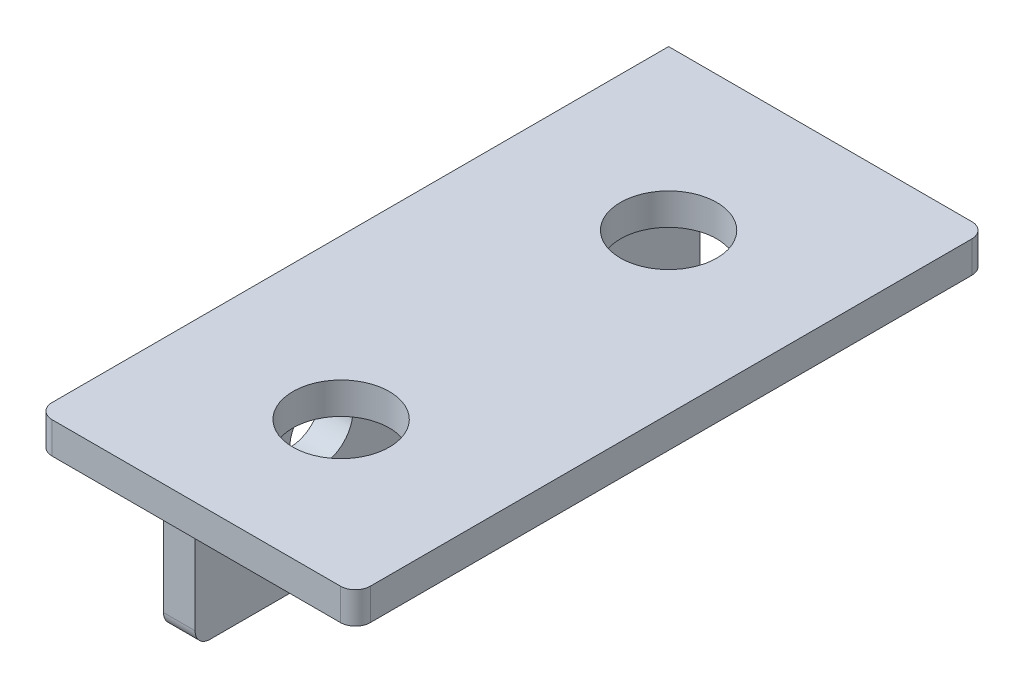
ISO-10303-21;
HEADER;
FILE_DESCRIPTION(('STEP AP214'),'2;1');
FILE_NAME('part.step','',(''),(''),'','','');
FILE_SCHEMA(('AUTOMOTIVE_DESIGN { 1 0 10303 214 1 1 1 1 }'));
ENDSEC;
DATA;
#1=APPLICATION_CONTEXT('core data for automotive mechanical design processes');
#2=APPLICATION_PROTOCOL_DEFINITION('international standard','automotive_design',2000,#1);
#3=PRODUCT_CONTEXT('',#1,'mechanical');
#4=PRODUCT('Part','Part','',(#3));
#5=PRODUCT_RELATED_PRODUCT_CATEGORY('part','',(#4));
#6=PRODUCT_DEFINITION_FORMATION('','',#4);
#7=PRODUCT_DEFINITION_CONTEXT('part definition',#1,'design');
#8=PRODUCT_DEFINITION('design','',#6,#7);
#9=PRODUCT_DEFINITION_SHAPE('','',#8);
#10=(LENGTH_UNIT() NAMED_UNIT(*) SI_UNIT(.MILLI.,.METRE.));
#11=(NAMED_UNIT(*) PLANE_ANGLE_UNIT() SI_UNIT($,.RADIAN.));
#12=(NAMED_UNIT(*) SI_UNIT($,.STERADIAN.) SOLID_ANGLE_UNIT());
#13=UNCERTAINTY_MEASURE_WITH_UNIT(LENGTH_MEASURE(1.E-05),#10,'distance_accuracy_value','');
#14=(GEOMETRIC_REPRESENTATION_CONTEXT(3) GLOBAL_UNCERTAINTY_ASSIGNED_CONTEXT((#13)) GLOBAL_UNIT_ASSIGNED_CONTEXT((#10,
#11,#12)) REPRESENTATION_CONTEXT('',''));
#15=CARTESIAN_POINT('',(0.,0.,0.));
#16=DIRECTION('',(0.,0.,1.));
#17=DIRECTION('',(1.,0.,0.));
#18=AXIS2_PLACEMENT_3D('',#15,#16,#17);
#19=CARTESIAN_POINT('',(3.175,0.,0.));
#20=DIRECTION('',(-1.,0.,0.));
#21=DIRECTION('',(0.,0.,1.));
#22=AXIS2_PLACEMENT_3D('',#19,#20,#21);
#23=PLANE('',#22);
#24=CARTESIAN_POINT('',(3.175,0.,12.7));
#25=DIRECTION('',(-1.,0.,0.));
#26=DIRECTION('',(0.,0.,1.));
#27=AXIS2_PLACEMENT_3D('',#24,#25,#26);
#28=CIRCLE('',#27,3.175);
#29=CARTESIAN_POINT('',(3.175,0.,15.875));
#30=VERTEX_POINT('',#29);
#31=EDGE_CURVE('E198',#30,#30,#28,.T.);
#32=ORIENTED_EDGE('',*,*,#31,.T.);
#33=EDGE_LOOP('',(#32));
#34=FACE_BOUND('',#33,.T.);
#35=DIRECTION('',(0.,-1.,0.));
#36=VECTOR('',#35,1.);
#37=CARTESIAN_POINT('',(3.175,-12.7,25.4));
#38=LINE('',#37,#36);
#39=CARTESIAN_POINT('',(3.175,8.02500000000001,25.4));
#40=VERTEX_POINT('',#39);
#41=CARTESIAN_POINT('',(3.175,-11.2,25.4));
#42=VERTEX_POINT('',#41);
#43=EDGE_CURVE('E224',#40,#42,#38,.T.);
#44=ORIENTED_EDGE('',*,*,#43,.T.);
#45=CARTESIAN_POINT('',(3.175,-11.2,23.9));
#46=DIRECTION('',(-1.,0.,0.));
#47=DIRECTION('',(0.,0.,1.));
#48=AXIS2_PLACEMENT_3D('',#45,#46,#47);
#49=CIRCLE('',#48,1.5);
#50=CARTESIAN_POINT('',(3.175,-12.7,23.9));
#51=VERTEX_POINT('',#50);
#52=EDGE_CURVE('E304',#42,#51,#49,.F.);
#53=ORIENTED_EDGE('',*,*,#52,.T.);
#54=DIRECTION('',(0.,0.,-1.));
#55=VECTOR('',#54,1.);
#56=CARTESIAN_POINT('',(3.175,-12.7,25.4));
#57=LINE('',#56,#55);
#58=CARTESIAN_POINT('',(3.175,-12.7,3.0875));
#59=VERTEX_POINT('',#58);
#60=EDGE_CURVE('E228',#51,#59,#57,.T.);
#61=ORIENTED_EDGE('',*,*,#60,.T.);
#62=DIRECTION('',(0.,-1.,0.));
#63=VECTOR('',#62,1.);
#64=CARTESIAN_POINT('',(3.175,9.52500000000001,3.0875));
#65=LINE('',#64,#63);
#66=CARTESIAN_POINT('',(3.175,8.02500000000001,3.0875));
#67=VERTEX_POINT('',#66);
#68=EDGE_CURVE('E300',#59,#67,#65,.F.);
#69=ORIENTED_EDGE('',*,*,#68,.T.);
#70=DIRECTION('',(0.,0.,-1.));
#71=VECTOR('',#70,1.);
#72=CARTESIAN_POINT('',(3.175,8.02500000000001,25.4));
#73=LINE('',#72,#71);
#74=EDGE_CURVE('E302',#67,#40,#73,.F.);
#75=ORIENTED_EDGE('',*,*,#74,.T.);
#76=EDGE_LOOP('',(#44,#53,#61,#69,#75));
#77=FACE_BOUND('',#76,.T.);
#78=ADVANCED_FACE('F33',(#34,#77),#23,.F.);
#79=CARTESIAN_POINT('',(0.,9.52500000000001,0.));
#80=DIRECTION('',(0.,1.,0.));
#81=DIRECTION('',(0.,0.,1.));
#82=AXIS2_PLACEMENT_3D('',#79,#80,#81);
#83=PLANE('',#82);
#84=CARTESIAN_POINT('',(16.,9.52500000000001,-9.4));
#85=DIRECTION('',(0.,1.,0.));
#86=DIRECTION('',(0.,0.,1.));
#87=AXIS2_PLACEMENT_3D('',#84,#85,#86);
#88=CIRCLE('',#87,4.85);
#89=CARTESIAN_POINT('',(16.,9.52500000000001,-4.55));
#90=VERTEX_POINT('',#89);
#91=EDGE_CURVE('E182',#90,#90,#88,.T.);
#92=ORIENTED_EDGE('',*,*,#91,.T.);
#93=EDGE_LOOP('',(#92));
#94=FACE_BOUND('',#93,.T.);
#95=CARTESIAN_POINT('',(16.,9.52500000000001,23.5362317770223));
#96=DIRECTION('',(0.,1.,0.));
#97=DIRECTION('',(0.,0.,1.));
#98=AXIS2_PLACEMENT_3D('',#95,#96,#97);
#99=CIRCLE('',#98,4.85);
#100=CARTESIAN_POINT('',(16.,9.52500000000001,28.3862317770223));
#101=VERTEX_POINT('',#100);
#102=EDGE_CURVE('E177',#101,#101,#99,.T.);
#103=ORIENTED_EDGE('',*,*,#102,.T.);
#104=EDGE_LOOP('',(#103));
#105=FACE_BOUND('',#104,.T.);
#106=DIRECTION('',(1.,0.,0.));
#107=VECTOR('',#106,1.);
#108=CARTESIAN_POINT('',(0.,9.52500000000001,38.1));
#109=LINE('',#108,#107);
#110=CARTESIAN_POINT('',(1.5,9.52500000000001,38.1));
#111=VERTEX_POINT('',#110);
#112=CARTESIAN_POINT('',(30.5,9.52500000000001,38.1));
#113=VERTEX_POINT('',#112);
#114=EDGE_CURVE('E206',#111,#113,#109,.T.);
#115=ORIENTED_EDGE('',*,*,#114,.F.);
#116=CARTESIAN_POINT('',(1.5,9.52500000000001,36.6));
#117=DIRECTION('',(0.,1.,0.));
#118=DIRECTION('',(0.,0.,1.));
#119=AXIS2_PLACEMENT_3D('',#116,#117,#118);
#120=CIRCLE('',#119,1.5);
#121=CARTESIAN_POINT('',(0.,9.52500000000001,36.6));
#122=VERTEX_POINT('',#121);
#123=EDGE_CURVE('E288',#111,#122,#120,.F.);
#124=ORIENTED_EDGE('',*,*,#123,.T.);
#125=DIRECTION('',(0.,0.,1.));
#126=VECTOR('',#125,1.);
#127=CARTESIAN_POINT('',(0.,9.52500000000001,-25.4));
#128=LINE('',#127,#126);
#129=CARTESIAN_POINT('',(0.,9.52500000000001,26.9));
#130=VERTEX_POINT('',#129);
#131=EDGE_CURVE('E203',#130,#122,#128,.T.);
#132=ORIENTED_EDGE('',*,*,#131,.F.);
#133=DIRECTION('',(1.,0.,0.));
#134=VECTOR('',#133,1.);
#135=CARTESIAN_POINT('',(3.175,9.52500000000001,26.9));
#136=LINE('',#135,#134);
#137=CARTESIAN_POINT('',(4.675,9.52500000000001,26.9));
#138=VERTEX_POINT('',#137);
#139=EDGE_CURVE('E273',#130,#138,#136,.T.);
#140=ORIENTED_EDGE('',*,*,#139,.T.);
#141=DIRECTION('',(0.,0.,-1.));
#142=VECTOR('',#141,1.);
#143=CARTESIAN_POINT('',(4.675,9.52500000000001,1.5875));
#144=LINE('',#143,#142);
#145=CARTESIAN_POINT('',(4.675,9.52500000000001,3.0875));
#146=VERTEX_POINT('',#145);
#147=EDGE_CURVE('E267',#138,#146,#144,.T.);
#148=ORIENTED_EDGE('',*,*,#147,.T.);
#149=DIRECTION('',(-1.,0.,0.));
#150=VECTOR('',#149,1.);
#151=CARTESIAN_POINT('',(25.3999999999999,9.52500000000001,3.0875));
#152=LINE('',#151,#150);
#153=CARTESIAN_POINT('',(26.0213203435596,9.52500000000001,3.0875));
#154=VERTEX_POINT('',#153);
#155=EDGE_CURVE('E144',#146,#154,#152,.F.);
#156=ORIENTED_EDGE('',*,*,#155,.T.);
#157=DIRECTION('',(0.,0.,-1.));
#158=VECTOR('',#157,1.);
#159=CARTESIAN_POINT('',(26.0213203435596,9.52500000000001,-1.5875));
#160=LINE('',#159,#158);
#161=CARTESIAN_POINT('',(26.0213203435596,9.52500000000001,-3.0875));
#162=VERTEX_POINT('',#161);
#163=EDGE_CURVE('E270',#154,#162,#160,.T.);
#164=ORIENTED_EDGE('',*,*,#163,.T.);
#165=DIRECTION('',(-1.,0.,0.));
#166=VECTOR('',#165,1.);
#167=CARTESIAN_POINT('',(0.,9.52500000000001,-3.0875));
#168=LINE('',#167,#166);
#169=CARTESIAN_POINT('',(4.675,9.52500000000001,-3.0875));
#170=VERTEX_POINT('',#169);
#171=EDGE_CURVE('E276',#162,#170,#168,.T.);
#172=ORIENTED_EDGE('',*,*,#171,.T.);
#173=DIRECTION('',(0.,0.,-1.));
#174=VECTOR('',#173,1.);
#175=CARTESIAN_POINT('',(4.675,9.52500000000001,-25.4));
#176=LINE('',#175,#174);
#177=CARTESIAN_POINT('',(4.675,9.52500000000001,-25.4));
#178=VERTEX_POINT('',#177);
#179=EDGE_CURVE('E279',#170,#178,#176,.T.);
#180=ORIENTED_EDGE('',*,*,#179,.T.);
#181=DIRECTION('',(-1.,0.,0.));
#182=VECTOR('',#181,1.);
#183=CARTESIAN_POINT('',(0.,9.52500000000001,-25.4));
#184=LINE('',#183,#182);
#185=CARTESIAN_POINT('',(30.5,9.52500000000001,-25.4));
#186=VERTEX_POINT('',#185);
#187=EDGE_CURVE('E213',#186,#178,#184,.T.);
#188=ORIENTED_EDGE('',*,*,#187,.F.);
#189=CARTESIAN_POINT('',(30.5,9.52500000000001,-23.9));
#190=DIRECTION('',(0.,1.,0.));
#191=DIRECTION('',(0.,0.,1.));
#192=AXIS2_PLACEMENT_3D('',#189,#190,#191);
#193=CIRCLE('',#192,1.5);
#194=CARTESIAN_POINT('',(32.,9.52500000000001,-23.9));
#195=VERTEX_POINT('',#194);
#196=EDGE_CURVE('E282',#186,#195,#193,.F.);
#197=ORIENTED_EDGE('',*,*,#196,.T.);
#198=DIRECTION('',(0.,0.,-1.));
#199=VECTOR('',#198,1.);
#200=CARTESIAN_POINT('',(32.,9.52500000000001,-25.4));
#201=LINE('',#200,#199);
#202=CARTESIAN_POINT('',(32.,9.52500000000001,36.6));
#203=VERTEX_POINT('',#202);
#204=EDGE_CURVE('E210',#203,#195,#201,.T.);
#205=ORIENTED_EDGE('',*,*,#204,.F.);
#206=CARTESIAN_POINT('',(30.5,9.52500000000001,36.6));
#207=DIRECTION('',(0.,1.,0.));
#208=DIRECTION('',(0.,0.,1.));
#209=AXIS2_PLACEMENT_3D('',#206,#207,#208);
#210=CIRCLE('',#209,1.5);
#211=EDGE_CURVE('E285',#203,#113,#210,.F.);
#212=ORIENTED_EDGE('',*,*,#211,.T.);
#213=EDGE_LOOP('',(#115,#124,#132,#140,#148,#156,#164,#172,#180,#188,#197,#205,#212));
#214=FACE_BOUND('',#213,.T.);
#215=ADVANCED_FACE('F354',(#94,#105,#214),#83,.F.);
#216=CARTESIAN_POINT('',(3.175,-12.7,25.4));
#217=DIRECTION('',(0.,0.,-1.));
#218=DIRECTION('',(-1.,0.,0.));
#219=AXIS2_PLACEMENT_3D('',#216,#217,#218);
#220=PLANE('',#219);
#221=ORIENTED_EDGE('',*,*,#43,.F.);
#222=DIRECTION('',(1.,0.,0.));
#223=VECTOR('',#222,1.);
#224=CARTESIAN_POINT('',(0.,8.02500000000001,25.4));
#225=LINE('',#224,#223);
#226=CARTESIAN_POINT('',(0.,8.02500000000001,25.4));
#227=VERTEX_POINT('',#226);
#228=EDGE_CURVE('E292',#40,#227,#225,.F.);
#229=ORIENTED_EDGE('',*,*,#228,.T.);
#230=DIRECTION('',(0.,-1.,0.));
#231=VECTOR('',#230,1.);
#232=CARTESIAN_POINT('',(0.,-12.7,25.4));
#233=LINE('',#232,#231);
#234=CARTESIAN_POINT('',(0.,-11.2,25.4));
#235=VERTEX_POINT('',#234);
#236=EDGE_CURVE('E236',#227,#235,#233,.T.);
#237=ORIENTED_EDGE('',*,*,#236,.T.);
#238=DIRECTION('',(-1.,0.,0.));
#239=VECTOR('',#238,1.);
#240=CARTESIAN_POINT('',(3.175,-11.2,25.4));
#241=LINE('',#240,#239);
#242=EDGE_CURVE('E79',#235,#42,#241,.F.);
#243=ORIENTED_EDGE('',*,*,#242,.T.);
#244=EDGE_LOOP('',(#221,#229,#237,#243));
#245=FACE_BOUND('',#244,.T.);
#246=ADVANCED_FACE('F472',(#245),#220,.F.);
#247=CARTESIAN_POINT('',(3.175,0.,-12.7));
#248=DIRECTION('',(-1.,0.,0.));
#249=DIRECTION('',(0.,0.,1.));
#250=AXIS2_PLACEMENT_3D('',#247,#248,#249);
#251=CIRCLE('',#250,3.175);
#252=CARTESIAN_POINT('',(3.175,0.,-9.525));
#253=VERTEX_POINT('',#252);
#254=EDGE_CURVE('E191',#253,#253,#251,.T.);
#255=ORIENTED_EDGE('',*,*,#254,.T.);
#256=EDGE_LOOP('',(#255));
#257=FACE_BOUND('',#256,.T.);
#258=CARTESIAN_POINT('',(3.175,-12.7,-3.0875));
#259=VERTEX_POINT('',#258);
#260=CARTESIAN_POINT('',(3.175,-12.7,-23.9));
#261=VERTEX_POINT('',#260);
#262=EDGE_CURVE('E227',#259,#261,#57,.T.);
#263=ORIENTED_EDGE('',*,*,#262,.T.);
#264=CARTESIAN_POINT('',(3.175,-11.2,-23.9));
#265=DIRECTION('',(-1.,0.,0.));
#266=DIRECTION('',(0.,0.,1.));
#267=AXIS2_PLACEMENT_3D('',#264,#265,#266);
#268=CIRCLE('',#267,1.5);
#269=CARTESIAN_POINT('',(3.175,-11.2,-25.4));
#270=VERTEX_POINT('',#269);
#271=EDGE_CURVE('E316',#261,#270,#268,.F.);
#272=ORIENTED_EDGE('',*,*,#271,.T.);
#273=DIRECTION('',(0.,1.,0.));
#274=VECTOR('',#273,1.);
#275=CARTESIAN_POINT('',(3.175,-12.7,-25.4));
#276=LINE('',#275,#274);
#277=CARTESIAN_POINT('',(3.175,8.02500000000001,-25.4));
#278=VERTEX_POINT('',#277);
#279=EDGE_CURVE('E221',#270,#278,#276,.T.);
#280=ORIENTED_EDGE('',*,*,#279,.T.);
#281=DIRECTION('',(0.,0.,-1.));
#282=VECTOR('',#281,1.);
#283=CARTESIAN_POINT('',(3.175,8.02500000000001,-1.5875));
#284=LINE('',#283,#282);
#285=CARTESIAN_POINT('',(3.175,8.02500000000001,-3.0875));
#286=VERTEX_POINT('',#285);
#287=EDGE_CURVE('E312',#278,#286,#284,.F.);
#288=ORIENTED_EDGE('',*,*,#287,.T.);
#289=DIRECTION('',(0.,-1.,0.));
#290=VECTOR('',#289,1.);
#291=CARTESIAN_POINT('',(3.175,0.,-3.0875));
#292=LINE('',#291,#290);
#293=EDGE_CURVE('E314',#286,#259,#292,.T.);
#294=ORIENTED_EDGE('',*,*,#293,.T.);
#295=EDGE_LOOP('',(#263,#272,#280,#288,#294));
#296=FACE_BOUND('',#295,.T.);
#297=ADVANCED_FACE('F423',(#257,#296),#23,.F.);
#298=CARTESIAN_POINT('',(3.175,-12.7,-25.4));
#299=DIRECTION('',(0.,0.,1.));
#300=DIRECTION('',(1.,0.,0.));
#301=AXIS2_PLACEMENT_3D('',#298,#299,#300);
#302=PLANE('',#301);
#303=ORIENTED_EDGE('',*,*,#279,.F.);
#304=DIRECTION('',(-1.,0.,0.));
#305=VECTOR('',#304,1.);
#306=CARTESIAN_POINT('',(3.175,-11.2,-25.4));
#307=LINE('',#306,#305);
#308=CARTESIAN_POINT('',(0.,-11.2,-25.4));
#309=VERTEX_POINT('',#308);
#310=EDGE_CURVE('E309',#270,#309,#307,.T.);
#311=ORIENTED_EDGE('',*,*,#310,.T.);
#312=DIRECTION('',(0.,1.,0.));
#313=VECTOR('',#312,1.);
#314=CARTESIAN_POINT('',(0.,-12.7,-25.4));
#315=LINE('',#314,#313);
#316=CARTESIAN_POINT('',(0.,12.7,-25.4));
#317=VERTEX_POINT('',#316);
#318=EDGE_CURVE('E216',#309,#317,#315,.T.);
#319=ORIENTED_EDGE('',*,*,#318,.T.);
#320=DIRECTION('',(-1.,0.,0.));
#321=VECTOR('',#320,1.);
#322=CARTESIAN_POINT('',(3.175,12.7,-25.4));
#323=LINE('',#322,#321);
#324=CARTESIAN_POINT('',(30.5,12.7,-25.4));
#325=VERTEX_POINT('',#324);
#326=EDGE_CURVE('E230',#325,#317,#323,.T.);
#327=ORIENTED_EDGE('',*,*,#326,.F.);
#328=DIRECTION('',(0.,1.,0.));
#329=VECTOR('',#328,1.);
#330=CARTESIAN_POINT('',(30.5,9.52500000000001,-25.4));
#331=LINE('',#330,#329);
#332=EDGE_CURVE('E306',#325,#186,#331,.F.);
#333=ORIENTED_EDGE('',*,*,#332,.T.);
#334=ORIENTED_EDGE('',*,*,#187,.T.);
#335=CARTESIAN_POINT('',(4.675,8.02500000000001,-25.4));
#336=DIRECTION('',(0.,0.,1.));
#337=DIRECTION('',(1.,0.,0.));
#338=AXIS2_PLACEMENT_3D('',#335,#336,#337);
#339=CIRCLE('',#338,1.5);
#340=EDGE_CURVE('E334',#178,#278,#339,.T.);
#341=ORIENTED_EDGE('',*,*,#340,.T.);
#342=EDGE_LOOP('',(#303,#311,#319,#327,#333,#334,#341));
#343=FACE_BOUND('',#342,.T.);
#344=ADVANCED_FACE('F419',(#343),#302,.F.);
#345=CARTESIAN_POINT('',(3.175,12.7,25.4));
#346=DIRECTION('',(0.,-1.,0.));
#347=DIRECTION('',(0.,0.,-1.));
#348=AXIS2_PLACEMENT_3D('',#345,#346,#347);
#349=PLANE('',#348);
#350=CARTESIAN_POINT('',(16.,12.7,-9.4));
#351=DIRECTION('',(0.,1.,0.));
#352=DIRECTION('',(0.,0.,1.));
#353=AXIS2_PLACEMENT_3D('',#350,#351,#352);
#354=CIRCLE('',#353,4.85);
#355=CARTESIAN_POINT('',(16.,12.7,-4.55));
#356=VERTEX_POINT('',#355);
#357=EDGE_CURVE('E172',#356,#356,#354,.T.);
#358=ORIENTED_EDGE('',*,*,#357,.F.);
#359=EDGE_LOOP('',(#358));
#360=FACE_BOUND('',#359,.T.);
#361=CARTESIAN_POINT('',(16.,12.7,23.5362317770223));
#362=DIRECTION('',(0.,1.,0.));
#363=DIRECTION('',(0.,0.,1.));
#364=AXIS2_PLACEMENT_3D('',#361,#362,#363);
#365=CIRCLE('',#364,4.85);
#366=CARTESIAN_POINT('',(16.,12.7,28.3862317770223));
#367=VERTEX_POINT('',#366);
#368=EDGE_CURVE('E169',#367,#367,#365,.T.);
#369=ORIENTED_EDGE('',*,*,#368,.F.);
#370=EDGE_LOOP('',(#369));
#371=FACE_BOUND('',#370,.T.);
#372=DIRECTION('',(0.,0.,1.));
#373=VECTOR('',#372,1.);
#374=CARTESIAN_POINT('',(0.,12.7,25.4));
#375=LINE('',#374,#373);
#376=CARTESIAN_POINT('',(0.,12.7,36.6));
#377=VERTEX_POINT('',#376);
#378=EDGE_CURVE('E233',#317,#377,#375,.T.);
#379=ORIENTED_EDGE('',*,*,#378,.T.);
#380=CARTESIAN_POINT('',(1.5,12.7,36.6));
#381=DIRECTION('',(0.,-1.,0.));
#382=DIRECTION('',(0.,0.,-1.));
#383=AXIS2_PLACEMENT_3D('',#380,#381,#382);
#384=CIRCLE('',#383,1.5);
#385=CARTESIAN_POINT('',(1.5,12.7,38.1));
#386=VERTEX_POINT('',#385);
#387=EDGE_CURVE('E257',#377,#386,#384,.F.);
#388=ORIENTED_EDGE('',*,*,#387,.T.);
#389=DIRECTION('',(1.,0.,0.));
#390=VECTOR('',#389,1.);
#391=CARTESIAN_POINT('',(0.,12.7,38.1));
#392=LINE('',#391,#390);
#393=CARTESIAN_POINT('',(30.5,12.7,38.1));
#394=VERTEX_POINT('',#393);
#395=EDGE_CURVE('E194',#386,#394,#392,.T.);
#396=ORIENTED_EDGE('',*,*,#395,.T.);
#397=CARTESIAN_POINT('',(30.5,12.7,36.6));
#398=DIRECTION('',(0.,-1.,0.));
#399=DIRECTION('',(0.,0.,-1.));
#400=AXIS2_PLACEMENT_3D('',#397,#398,#399);
#401=CIRCLE('',#400,1.5);
#402=CARTESIAN_POINT('',(32.,12.7,36.6));
#403=VERTEX_POINT('',#402);
#404=EDGE_CURVE('E254',#394,#403,#401,.F.);
#405=ORIENTED_EDGE('',*,*,#404,.T.);
#406=DIRECTION('',(0.,0.,-1.));
#407=VECTOR('',#406,1.);
#408=CARTESIAN_POINT('',(32.,12.7,-25.4));
#409=LINE('',#408,#407);
#410=CARTESIAN_POINT('',(32.,12.7,-23.9));
#411=VERTEX_POINT('',#410);
#412=EDGE_CURVE('E207',#403,#411,#409,.T.);
#413=ORIENTED_EDGE('',*,*,#412,.T.);
#414=CARTESIAN_POINT('',(30.5,12.7,-23.9));
#415=DIRECTION('',(0.,-1.,0.));
#416=DIRECTION('',(0.,0.,-1.));
#417=AXIS2_PLACEMENT_3D('',#414,#415,#416);
#418=CIRCLE('',#417,1.5);
#419=EDGE_CURVE('E251',#411,#325,#418,.F.);
#420=ORIENTED_EDGE('',*,*,#419,.T.);
#421=ORIENTED_EDGE('',*,*,#326,.T.);
#422=EDGE_LOOP('',(#379,#388,#396,#405,#413,#420,#421));
#423=FACE_BOUND('',#422,.T.);
#424=ADVANCED_FACE('F377',(#360,#371,#423),#349,.F.);
#425=CARTESIAN_POINT('',(3.175,-12.7,25.4));
#426=DIRECTION('',(0.,1.,0.));
#427=DIRECTION('',(0.,0.,1.));
#428=AXIS2_PLACEMENT_3D('',#425,#426,#427);
#429=PLANE('',#428);
#430=ORIENTED_EDGE('',*,*,#60,.F.);
#431=DIRECTION('',(-1.,0.,0.));
#432=VECTOR('',#431,1.);
#433=CARTESIAN_POINT('',(3.175,-12.7,23.9));
#434=LINE('',#433,#432);
#435=CARTESIAN_POINT('',(0.,-12.7,23.9));
#436=VERTEX_POINT('',#435);
#437=EDGE_CURVE('E297',#51,#436,#434,.T.);
#438=ORIENTED_EDGE('',*,*,#437,.T.);
#439=DIRECTION('',(0.,0.,-1.));
#440=VECTOR('',#439,1.);
#441=CARTESIAN_POINT('',(0.,-12.7,25.4));
#442=LINE('',#441,#440);
#443=CARTESIAN_POINT('',(0.,-12.7,-23.9));
#444=VERTEX_POINT('',#443);
#445=EDGE_CURVE('E225',#436,#444,#442,.T.);
#446=ORIENTED_EDGE('',*,*,#445,.T.);
#447=DIRECTION('',(-1.,0.,0.));
#448=VECTOR('',#447,1.);
#449=CARTESIAN_POINT('',(3.175,-12.7,-23.9));
#450=LINE('',#449,#448);
#451=EDGE_CURVE('E295',#444,#261,#450,.F.);
#452=ORIENTED_EDGE('',*,*,#451,.T.);
#453=ORIENTED_EDGE('',*,*,#262,.F.);
#454=DIRECTION('',(0.,0.,-1.));
#455=VECTOR('',#454,1.);
#456=CARTESIAN_POINT('',(3.175,-12.7,1.5875));
#457=LINE('',#456,#455);
#458=EDGE_CURVE('E50',#59,#259,#457,.T.);
#459=ORIENTED_EDGE('',*,*,#458,.F.);
#460=EDGE_LOOP('',(#430,#438,#446,#452,#453,#459));
#461=FACE_BOUND('',#460,.T.);
#462=ADVANCED_FACE('F462',(#461),#429,.F.);
#463=CARTESIAN_POINT('',(0.,0.,0.));
#464=DIRECTION('',(-1.,0.,0.));
#465=DIRECTION('',(0.,0.,1.));
#466=AXIS2_PLACEMENT_3D('',#463,#464,#465);
#467=PLANE('',#466);
#468=CARTESIAN_POINT('',(0.,0.,-12.7));
#469=DIRECTION('',(-1.,0.,0.));
#470=DIRECTION('',(0.,0.,1.));
#471=AXIS2_PLACEMENT_3D('',#468,#469,#470);
#472=CIRCLE('',#471,3.175);
#473=CARTESIAN_POINT('',(0.,0.,-9.525));
#474=VERTEX_POINT('',#473);
#475=EDGE_CURVE('E195',#474,#474,#472,.T.);
#476=ORIENTED_EDGE('',*,*,#475,.F.);
#477=EDGE_LOOP('',(#476));
#478=FACE_BOUND('',#477,.T.);
#479=CARTESIAN_POINT('',(0.,0.,12.7));
#480=DIRECTION('',(-1.,0.,0.));
#481=DIRECTION('',(0.,0.,1.));
#482=AXIS2_PLACEMENT_3D('',#479,#480,#481);
#483=CIRCLE('',#482,3.175);
#484=CARTESIAN_POINT('',(0.,0.,15.875));
#485=VERTEX_POINT('',#484);
#486=EDGE_CURVE('E190',#485,#485,#483,.T.);
#487=ORIENTED_EDGE('',*,*,#486,.F.);
#488=EDGE_LOOP('',(#487));
#489=FACE_BOUND('',#488,.T.);
#490=ORIENTED_EDGE('',*,*,#131,.T.);
#491=DIRECTION('',(0.,1.,0.));
#492=VECTOR('',#491,1.);
#493=CARTESIAN_POINT('',(0.,0.,36.6));
#494=LINE('',#493,#492);
#495=EDGE_CURVE('E248',#122,#377,#494,.T.);
#496=ORIENTED_EDGE('',*,*,#495,.T.);
#497=ORIENTED_EDGE('',*,*,#378,.F.);
#498=ORIENTED_EDGE('',*,*,#318,.F.);
#499=CARTESIAN_POINT('',(0.,-11.2,-23.9));
#500=DIRECTION('',(-1.,0.,0.));
#501=DIRECTION('',(0.,0.,1.));
#502=AXIS2_PLACEMENT_3D('',#499,#500,#501);
#503=CIRCLE('',#502,1.5);
#504=EDGE_CURVE('E242',#309,#444,#503,.T.);
#505=ORIENTED_EDGE('',*,*,#504,.T.);
#506=ORIENTED_EDGE('',*,*,#445,.F.);
#507=CARTESIAN_POINT('',(0.,-11.2,23.9));
#508=DIRECTION('',(-1.,0.,0.));
#509=DIRECTION('',(0.,0.,1.));
#510=AXIS2_PLACEMENT_3D('',#507,#508,#509);
#511=CIRCLE('',#510,1.5);
#512=EDGE_CURVE('E245',#436,#235,#511,.T.);
#513=ORIENTED_EDGE('',*,*,#512,.T.);
#514=ORIENTED_EDGE('',*,*,#236,.F.);
#515=CARTESIAN_POINT('',(0.,8.02500000000001,26.9));
#516=DIRECTION('',(-1.,0.,0.));
#517=DIRECTION('',(0.,0.,1.));
#518=AXIS2_PLACEMENT_3D('',#515,#516,#517);
#519=CIRCLE('',#518,1.5);
#520=EDGE_CURVE('E125',#227,#130,#519,.F.);
#521=ORIENTED_EDGE('',*,*,#520,.T.);
#522=EDGE_LOOP('',(#490,#496,#497,#498,#505,#506,#513,#514,#521));
#523=FACE_BOUND('',#522,.T.);
#524=ADVANCED_FACE('F361',(#478,#489,#523),#467,.T.);
#525=CARTESIAN_POINT('',(32.,9.52500000000001,-25.4));
#526=DIRECTION('',(1.,0.,0.));
#527=DIRECTION('',(0.,0.,-1.));
#528=AXIS2_PLACEMENT_3D('',#525,#526,#527);
#529=PLANE('',#528);
#530=ORIENTED_EDGE('',*,*,#412,.F.);
#531=DIRECTION('',(0.,1.,0.));
#532=VECTOR('',#531,1.);
#533=CARTESIAN_POINT('',(32.,9.52500000000001,36.6));
#534=LINE('',#533,#532);
#535=EDGE_CURVE('E321',#403,#203,#534,.F.);
#536=ORIENTED_EDGE('',*,*,#535,.T.);
#537=ORIENTED_EDGE('',*,*,#204,.T.);
#538=DIRECTION('',(0.,1.,0.));
#539=VECTOR('',#538,1.);
#540=CARTESIAN_POINT('',(32.,12.7,-23.9));
#541=LINE('',#540,#539);
#542=EDGE_CURVE('E318',#195,#411,#541,.T.);
#543=ORIENTED_EDGE('',*,*,#542,.T.);
#544=EDGE_LOOP('',(#530,#536,#537,#543));
#545=FACE_BOUND('',#544,.T.);
#546=ADVANCED_FACE('F453',(#545),#529,.T.);
#547=CARTESIAN_POINT('',(0.,9.52500000000001,38.1));
#548=DIRECTION('',(0.,0.,1.));
#549=DIRECTION('',(1.,0.,0.));
#550=AXIS2_PLACEMENT_3D('',#547,#548,#549);
#551=PLANE('',#550);
#552=ORIENTED_EDGE('',*,*,#395,.F.);
#553=DIRECTION('',(0.,1.,0.));
#554=VECTOR('',#553,1.);
#555=CARTESIAN_POINT('',(1.5,9.52500000000001,38.1));
#556=LINE('',#555,#554);
#557=EDGE_CURVE('E263',#386,#111,#556,.F.);
#558=ORIENTED_EDGE('',*,*,#557,.T.);
#559=ORIENTED_EDGE('',*,*,#114,.T.);
#560=DIRECTION('',(0.,1.,0.));
#561=VECTOR('',#560,1.);
#562=CARTESIAN_POINT('',(30.5,9.52500000000001,38.1));
#563=LINE('',#562,#561);
#564=EDGE_CURVE('E260',#113,#394,#563,.T.);
#565=ORIENTED_EDGE('',*,*,#564,.T.);
#566=EDGE_LOOP('',(#552,#558,#559,#565));
#567=FACE_BOUND('',#566,.T.);
#568=ADVANCED_FACE('F381',(#567),#551,.T.);
#569=CARTESIAN_POINT('',(3.175,0.,12.7));
#570=DIRECTION('',(-1.,0.,0.));
#571=DIRECTION('',(0.,0.,1.));
#572=AXIS2_PLACEMENT_3D('',#569,#570,#571);
#573=CYLINDRICAL_SURFACE('',#572,3.175);
#574=ORIENTED_EDGE('',*,*,#31,.F.);
#575=EDGE_LOOP('',(#574));
#576=FACE_BOUND('',#575,.T.);
#577=ORIENTED_EDGE('',*,*,#486,.T.);
#578=EDGE_LOOP('',(#577));
#579=FACE_BOUND('',#578,.T.);
#580=ADVANCED_FACE('F460',(#576,#579),#573,.F.);
#581=CARTESIAN_POINT('',(3.175,0.,-12.7));
#582=DIRECTION('',(-1.,0.,0.));
#583=DIRECTION('',(0.,0.,1.));
#584=AXIS2_PLACEMENT_3D('',#581,#582,#583);
#585=CYLINDRICAL_SURFACE('',#584,3.175);
#586=ORIENTED_EDGE('',*,*,#254,.F.);
#587=EDGE_LOOP('',(#586));
#588=FACE_BOUND('',#587,.T.);
#589=ORIENTED_EDGE('',*,*,#475,.T.);
#590=EDGE_LOOP('',(#589));
#591=FACE_BOUND('',#590,.T.);
#592=ADVANCED_FACE('F485',(#588,#591),#585,.F.);
#593=CARTESIAN_POINT('',(3.175,-12.7,1.5875));
#594=DIRECTION('',(-0.707106781186549,0.707106781186546,0.));
#595=DIRECTION('',(-0.707106781186546,-0.707106781186549,0.));
#596=AXIS2_PLACEMENT_3D('',#593,#594,#595);
#597=PLANE('',#596);
#598=DIRECTION('',(0.707106781186546,0.707106781186549,0.));
#599=VECTOR('',#598,1.);
#600=CARTESIAN_POINT('',(3.175,-12.7,-1.5875));
#601=LINE('',#600,#599);
#602=CARTESIAN_POINT('',(4.675,-11.2,-1.5875));
#603=VERTEX_POINT('',#602);
#604=CARTESIAN_POINT('',(23.8999999999999,8.025,-1.5875));
#605=VERTEX_POINT('',#604);
#606=EDGE_CURVE('E185',#603,#605,#601,.T.);
#607=ORIENTED_EDGE('',*,*,#606,.T.);
#608=CARTESIAN_POINT('',(23.8999999999999,8.02500000000001,-3.0875));
#609=DIRECTION('',(-0.707106781186549,0.707106781186546,0.));
#610=DIRECTION('',(-0.707106781186546,-0.707106781186549,0.));
#611=AXIS2_PLACEMENT_3D('',#608,#609,#610);
#612=ELLIPSE('',#611,2.12132034355964,1.5);
#613=CARTESIAN_POINT('',(24.9606601717797,9.08566017177982,-2.02683982822018));
#614=VERTEX_POINT('',#613);
#615=EDGE_CURVE('E330',#605,#614,#612,.T.);
#616=ORIENTED_EDGE('',*,*,#615,.T.);
#617=DIRECTION('',(0.,0.,-1.));
#618=VECTOR('',#617,1.);
#619=CARTESIAN_POINT('',(24.9606601717797,9.08566017177982,1.5875));
#620=LINE('',#619,#618);
#621=CARTESIAN_POINT('',(24.9606601717797,9.08566017177982,2.02683982822018));
#622=VERTEX_POINT('',#621);
#623=EDGE_CURVE('E59',#614,#622,#620,.F.);
#624=ORIENTED_EDGE('',*,*,#623,.T.);
#625=CARTESIAN_POINT('',(23.8999999999999,8.02500000000001,3.0875));
#626=DIRECTION('',(-0.707106781186549,0.707106781186546,0.));
#627=DIRECTION('',(0.707106781186546,0.707106781186549,0.));
#628=AXIS2_PLACEMENT_3D('',#625,#626,#627);
#629=ELLIPSE('',#628,2.12132034355964,1.5);
#630=CARTESIAN_POINT('',(23.8999999999999,8.025,1.5875));
#631=VERTEX_POINT('',#630);
#632=EDGE_CURVE('E42',#622,#631,#629,.T.);
#633=ORIENTED_EDGE('',*,*,#632,.T.);
#634=DIRECTION('',(0.707106781186546,0.707106781186549,0.));
#635=VECTOR('',#634,1.);
#636=CARTESIAN_POINT('',(3.175,-12.7,1.5875));
#637=LINE('',#636,#635);
#638=CARTESIAN_POINT('',(4.675,-11.2,1.5875));
#639=VERTEX_POINT('',#638);
#640=EDGE_CURVE('E121',#639,#631,#637,.T.);
#641=ORIENTED_EDGE('',*,*,#640,.F.);
#642=CARTESIAN_POINT('',(4.675,-11.2,3.0875));
#643=DIRECTION('',(-0.707106781186549,0.707106781186546,0.));
#644=DIRECTION('',(0.707106781186546,0.707106781186549,0.));
#645=AXIS2_PLACEMENT_3D('',#642,#643,#644);
#646=ELLIPSE('',#645,2.12132034355965,1.5);
#647=EDGE_CURVE('E11',#639,#59,#646,.T.);
#648=ORIENTED_EDGE('',*,*,#647,.T.);
#649=ORIENTED_EDGE('',*,*,#458,.T.);
#650=CARTESIAN_POINT('',(4.675,-11.2,-3.0875));
#651=DIRECTION('',(-0.707106781186549,0.707106781186546,0.));
#652=DIRECTION('',(-0.707106781186546,-0.707106781186549,0.));
#653=AXIS2_PLACEMENT_3D('',#650,#651,#652);
#654=ELLIPSE('',#653,2.12132034355965,1.5);
#655=EDGE_CURVE('E332',#259,#603,#654,.T.);
#656=ORIENTED_EDGE('',*,*,#655,.T.);
#657=EDGE_LOOP('',(#607,#616,#624,#633,#641,#648,#649,#656));
#658=FACE_BOUND('',#657,.T.);
#659=ADVANCED_FACE('F488',(#658),#597,.F.);
#660=CARTESIAN_POINT('',(0.,0.,1.5875));
#661=DIRECTION('',(0.,0.,-1.));
#662=DIRECTION('',(-1.,0.,0.));
#663=AXIS2_PLACEMENT_3D('',#660,#661,#662);
#664=PLANE('',#663);
#665=ORIENTED_EDGE('',*,*,#640,.T.);
#666=DIRECTION('',(-1.,0.,0.));
#667=VECTOR('',#666,1.);
#668=CARTESIAN_POINT('',(3.175,8.02500000000001,1.5875));
#669=LINE('',#668,#667);
#670=CARTESIAN_POINT('',(4.675,8.02500000000001,1.5875));
#671=VERTEX_POINT('',#670);
#672=EDGE_CURVE('E116',#631,#671,#669,.T.);
#673=ORIENTED_EDGE('',*,*,#672,.T.);
#674=DIRECTION('',(0.,-1.,0.));
#675=VECTOR('',#674,1.);
#676=CARTESIAN_POINT('',(4.675,-12.7,1.5875));
#677=LINE('',#676,#675);
#678=EDGE_CURVE('E119',#671,#639,#677,.T.);
#679=ORIENTED_EDGE('',*,*,#678,.T.);
#680=EDGE_LOOP('',(#665,#673,#679));
#681=FACE_BOUND('',#680,.T.);
#682=ADVANCED_FACE('F118',(#681),#664,.F.);
#683=CARTESIAN_POINT('',(0.,0.,-1.5875));
#684=DIRECTION('',(0.,0.,-1.));
#685=DIRECTION('',(-1.,0.,0.));
#686=AXIS2_PLACEMENT_3D('',#683,#684,#685);
#687=PLANE('',#686);
#688=DIRECTION('',(0.,-1.,0.));
#689=VECTOR('',#688,1.);
#690=CARTESIAN_POINT('',(4.675,0.,-1.5875));
#691=LINE('',#690,#689);
#692=CARTESIAN_POINT('',(4.675,8.02500000000001,-1.5875));
#693=VERTEX_POINT('',#692);
#694=EDGE_CURVE('E325',#603,#693,#691,.F.);
#695=ORIENTED_EDGE('',*,*,#694,.T.);
#696=DIRECTION('',(-1.,0.,0.));
#697=VECTOR('',#696,1.);
#698=CARTESIAN_POINT('',(0.,8.02500000000001,-1.5875));
#699=LINE('',#698,#697);
#700=EDGE_CURVE('E135',#693,#605,#699,.F.);
#701=ORIENTED_EDGE('',*,*,#700,.T.);
#702=ORIENTED_EDGE('',*,*,#606,.F.);
#703=EDGE_LOOP('',(#695,#701,#702));
#704=FACE_BOUND('',#703,.T.);
#705=ADVANCED_FACE('F503',(#704),#687,.T.);
#706=CARTESIAN_POINT('',(16.,2.7,23.5362317770223));
#707=DIRECTION('',(0.,1.,0.));
#708=DIRECTION('',(0.,0.,1.));
#709=AXIS2_PLACEMENT_3D('',#706,#707,#708);
#710=CYLINDRICAL_SURFACE('',#709,4.85);
#711=ORIENTED_EDGE('',*,*,#368,.T.);
#712=EDGE_LOOP('',(#711));
#713=FACE_BOUND('',#712,.T.);
#714=ORIENTED_EDGE('',*,*,#102,.F.);
#715=EDGE_LOOP('',(#714));
#716=FACE_BOUND('',#715,.T.);
#717=ADVANCED_FACE('F506',(#713,#716),#710,.F.);
#718=CARTESIAN_POINT('',(16.,2.7,-9.4));
#719=DIRECTION('',(0.,1.,0.));
#720=DIRECTION('',(0.,0.,1.));
#721=AXIS2_PLACEMENT_3D('',#718,#719,#720);
#722=CYLINDRICAL_SURFACE('',#721,4.85);
#723=ORIENTED_EDGE('',*,*,#357,.T.);
#724=EDGE_LOOP('',(#723));
#725=FACE_BOUND('',#724,.T.);
#726=ORIENTED_EDGE('',*,*,#91,.F.);
#727=EDGE_LOOP('',(#726));
#728=FACE_BOUND('',#727,.T.);
#729=ADVANCED_FACE('F512',(#725,#728),#722,.F.);
#730=CARTESIAN_POINT('',(1.5,0.,36.6));
#731=DIRECTION('',(0.,1.,0.));
#732=DIRECTION('',(0.,0.,1.));
#733=AXIS2_PLACEMENT_3D('',#730,#731,#732);
#734=CYLINDRICAL_SURFACE('',#733,1.5);
#735=ORIENTED_EDGE('',*,*,#123,.F.);
#736=ORIENTED_EDGE('',*,*,#557,.F.);
#737=ORIENTED_EDGE('',*,*,#387,.F.);
#738=ORIENTED_EDGE('',*,*,#495,.F.);
#739=EDGE_LOOP('',(#735,#736,#737,#738));
#740=FACE_BOUND('',#739,.T.);
#741=ADVANCED_FACE('F369',(#740),#734,.T.);
#742=CARTESIAN_POINT('',(4.675,8.02500000000001,0.));
#743=DIRECTION('',(0.,0.,1.));
#744=DIRECTION('',(1.,0.,0.));
#745=AXIS2_PLACEMENT_3D('',#742,#743,#744);
#746=CYLINDRICAL_SURFACE('',#745,1.5);
#747=ORIENTED_EDGE('',*,*,#340,.F.);
#748=ORIENTED_EDGE('',*,*,#179,.F.);
#749=CARTESIAN_POINT('',(4.675,8.02500000000001,-3.0875));
#750=DIRECTION('',(0.,0.,-1.));
#751=DIRECTION('',(-1.,0.,0.));
#752=AXIS2_PLACEMENT_3D('',#749,#750,#751);
#753=CIRCLE('',#752,1.5);
#754=EDGE_CURVE('E37',#286,#170,#753,.T.);
#755=ORIENTED_EDGE('',*,*,#754,.F.);
#756=ORIENTED_EDGE('',*,*,#287,.F.);
#757=EDGE_LOOP('',(#747,#748,#755,#756));
#758=FACE_BOUND('',#757,.T.);
#759=ADVANCED_FACE('F415',(#758),#746,.F.);
#760=CARTESIAN_POINT('',(4.675,0.,-3.0875));
#761=DIRECTION('',(0.,-1.,0.));
#762=DIRECTION('',(0.,0.,-1.));
#763=AXIS2_PLACEMENT_3D('',#760,#761,#762);
#764=CYLINDRICAL_SURFACE('',#763,1.5);
#765=ORIENTED_EDGE('',*,*,#655,.F.);
#766=ORIENTED_EDGE('',*,*,#293,.F.);
#767=CARTESIAN_POINT('',(4.675,8.02500000000001,-3.0875));
#768=DIRECTION('',(0.,-1.,0.));
#769=DIRECTION('',(0.,0.,-1.));
#770=AXIS2_PLACEMENT_3D('',#767,#768,#769);
#771=CIRCLE('',#770,1.5);
#772=EDGE_CURVE('E163',#693,#286,#771,.T.);
#773=ORIENTED_EDGE('',*,*,#772,.F.);
#774=ORIENTED_EDGE('',*,*,#694,.F.);
#775=EDGE_LOOP('',(#765,#766,#773,#774));
#776=FACE_BOUND('',#775,.T.);
#777=ADVANCED_FACE('F555',(#776),#764,.F.);
#778=CARTESIAN_POINT('',(4.675,8.02500000000001,-3.0875));
#779=DIRECTION('',(0.,0.,1.));
#780=DIRECTION('',(1.,0.,0.));
#781=AXIS2_PLACEMENT_3D('',#778,#779,#780);
#782=SPHERICAL_SURFACE('',#781,1.5);
#783=ORIENTED_EDGE('',*,*,#772,.T.);
#784=ORIENTED_EDGE('',*,*,#754,.T.);
#785=CARTESIAN_POINT('',(4.675,8.02500000000001,-3.0875));
#786=DIRECTION('',(1.,0.,0.));
#787=DIRECTION('',(0.,0.,-1.));
#788=AXIS2_PLACEMENT_3D('',#785,#786,#787);
#789=CIRCLE('',#788,1.5);
#790=EDGE_CURVE('E161',#693,#170,#789,.F.);
#791=ORIENTED_EDGE('',*,*,#790,.F.);
#792=EDGE_LOOP('',(#783,#784,#791));
#793=FACE_BOUND('',#792,.T.);
#794=ADVANCED_FACE('F552',(#793),#782,.F.);
#795=CARTESIAN_POINT('',(0.,8.02500000000001,-3.0875));
#796=DIRECTION('',(-1.,0.,0.));
#797=DIRECTION('',(0.,0.,1.));
#798=AXIS2_PLACEMENT_3D('',#795,#796,#797);
#799=CYLINDRICAL_SURFACE('',#798,1.5);
#800=ORIENTED_EDGE('',*,*,#790,.T.);
#801=ORIENTED_EDGE('',*,*,#171,.F.);
#802=CARTESIAN_POINT('',(26.0213203435596,8.02500000000001,-3.0875));
#803=DIRECTION('',(-0.707106781186547,0.,-0.707106781186547));
#804=DIRECTION('',(-0.707106781186547,0.,0.707106781186547));
#805=AXIS2_PLACEMENT_3D('',#802,#803,#804);
#806=ELLIPSE('',#805,2.12132034355964,1.5);
#807=EDGE_CURVE('E158',#614,#162,#806,.T.);
#808=ORIENTED_EDGE('',*,*,#807,.F.);
#809=ORIENTED_EDGE('',*,*,#615,.F.);
#810=ORIENTED_EDGE('',*,*,#700,.F.);
#811=EDGE_LOOP('',(#800,#801,#808,#809,#810));
#812=FACE_BOUND('',#811,.T.);
#813=ADVANCED_FACE('F548',(#812),#799,.F.);
#814=CARTESIAN_POINT('',(26.0213203435596,8.02500000000001,0.));
#815=DIRECTION('',(0.,0.,1.));
#816=DIRECTION('',(1.,0.,0.));
#817=AXIS2_PLACEMENT_3D('',#814,#815,#816);
#818=CYLINDRICAL_SURFACE('',#817,1.5);
#819=ORIENTED_EDGE('',*,*,#807,.T.);
#820=ORIENTED_EDGE('',*,*,#163,.F.);
#821=CARTESIAN_POINT('',(26.0213203435596,8.02500000000001,3.0875));
#822=DIRECTION('',(0.707106781186547,0.,-0.707106781186547));
#823=DIRECTION('',(0.707106781186547,0.,0.707106781186547));
#824=AXIS2_PLACEMENT_3D('',#821,#822,#823);
#825=ELLIPSE('',#824,2.12132034355964,1.5);
#826=EDGE_CURVE('E147',#622,#154,#825,.T.);
#827=ORIENTED_EDGE('',*,*,#826,.F.);
#828=ORIENTED_EDGE('',*,*,#623,.F.);
#829=EDGE_LOOP('',(#819,#820,#827,#828));
#830=FACE_BOUND('',#829,.T.);
#831=ADVANCED_FACE('F545',(#830),#818,.F.);
#832=CARTESIAN_POINT('',(0.,8.02500000000001,3.0875));
#833=DIRECTION('',(1.,0.,0.));
#834=DIRECTION('',(0.,0.,-1.));
#835=AXIS2_PLACEMENT_3D('',#832,#833,#834);
#836=CYLINDRICAL_SURFACE('',#835,1.5);
#837=ORIENTED_EDGE('',*,*,#826,.T.);
#838=ORIENTED_EDGE('',*,*,#155,.F.);
#839=CARTESIAN_POINT('',(4.675,8.02500000000001,3.0875));
#840=DIRECTION('',(1.,0.,0.));
#841=DIRECTION('',(0.,0.,-1.));
#842=AXIS2_PLACEMENT_3D('',#839,#840,#841);
#843=CIRCLE('',#842,1.5);
#844=EDGE_CURVE('E139',#671,#146,#843,.T.);
#845=ORIENTED_EDGE('',*,*,#844,.F.);
#846=ORIENTED_EDGE('',*,*,#672,.F.);
#847=ORIENTED_EDGE('',*,*,#632,.F.);
#848=EDGE_LOOP('',(#837,#838,#845,#846,#847));
#849=FACE_BOUND('',#848,.T.);
#850=ADVANCED_FACE('F141',(#849),#836,.F.);
#851=CARTESIAN_POINT('',(4.675,0.,3.0875));
#852=DIRECTION('',(0.,1.,0.));
#853=DIRECTION('',(0.,0.,1.));
#854=AXIS2_PLACEMENT_3D('',#851,#852,#853);
#855=CYLINDRICAL_SURFACE('',#854,1.5);
#856=ORIENTED_EDGE('',*,*,#647,.F.);
#857=ORIENTED_EDGE('',*,*,#678,.F.);
#858=CARTESIAN_POINT('',(4.675,8.02500000000001,3.0875));
#859=DIRECTION('',(0.,-1.,0.));
#860=DIRECTION('',(0.,0.,-1.));
#861=AXIS2_PLACEMENT_3D('',#858,#859,#860);
#862=CIRCLE('',#861,1.5);
#863=EDGE_CURVE('E133',#67,#671,#862,.T.);
#864=ORIENTED_EDGE('',*,*,#863,.F.);
#865=ORIENTED_EDGE('',*,*,#68,.F.);
#866=EDGE_LOOP('',(#856,#857,#864,#865));
#867=FACE_BOUND('',#866,.T.);
#868=ADVANCED_FACE('F130',(#867),#855,.F.);
#869=CARTESIAN_POINT('',(4.675,8.02500000000001,3.0875));
#870=DIRECTION('',(0.,0.,1.));
#871=DIRECTION('',(1.,0.,0.));
#872=AXIS2_PLACEMENT_3D('',#869,#870,#871);
#873=SPHERICAL_SURFACE('',#872,1.5);
#874=ORIENTED_EDGE('',*,*,#863,.T.);
#875=ORIENTED_EDGE('',*,*,#844,.T.);
#876=CARTESIAN_POINT('',(4.675,8.02500000000001,3.0875));
#877=DIRECTION('',(0.,0.,1.));
#878=DIRECTION('',(1.,0.,0.));
#879=AXIS2_PLACEMENT_3D('',#876,#877,#878);
#880=CIRCLE('',#879,1.5);
#881=EDGE_CURVE('E150',#67,#146,#880,.F.);
#882=ORIENTED_EDGE('',*,*,#881,.F.);
#883=EDGE_LOOP('',(#874,#875,#882));
#884=FACE_BOUND('',#883,.T.);
#885=ADVANCED_FACE('F149',(#884),#873,.F.);
#886=CARTESIAN_POINT('',(4.675,8.02500000000001,0.));
#887=DIRECTION('',(0.,0.,1.));
#888=DIRECTION('',(1.,0.,0.));
#889=AXIS2_PLACEMENT_3D('',#886,#887,#888);
#890=CYLINDRICAL_SURFACE('',#889,1.5);
#891=ORIENTED_EDGE('',*,*,#881,.T.);
#892=ORIENTED_EDGE('',*,*,#147,.F.);
#893=CARTESIAN_POINT('',(4.675,8.02500000000001,26.9));
#894=DIRECTION('',(-0.707106781186547,0.,0.707106781186547));
#895=DIRECTION('',(0.707106781186547,0.,0.707106781186547));
#896=AXIS2_PLACEMENT_3D('',#893,#894,#895);
#897=ELLIPSE('',#896,2.12132034355964,1.5);
#898=EDGE_CURVE('E153',#40,#138,#897,.F.);
#899=ORIENTED_EDGE('',*,*,#898,.F.);
#900=ORIENTED_EDGE('',*,*,#74,.F.);
#901=EDGE_LOOP('',(#891,#892,#899,#900));
#902=FACE_BOUND('',#901,.T.);
#903=ADVANCED_FACE('F350',(#902),#890,.F.);
#904=CARTESIAN_POINT('',(0.,8.02500000000001,26.9));
#905=DIRECTION('',(-1.,0.,0.));
#906=DIRECTION('',(0.,0.,1.));
#907=AXIS2_PLACEMENT_3D('',#904,#905,#906);
#908=CYLINDRICAL_SURFACE('',#907,1.5);
#909=ORIENTED_EDGE('',*,*,#520,.F.);
#910=ORIENTED_EDGE('',*,*,#228,.F.);
#911=ORIENTED_EDGE('',*,*,#898,.T.);
#912=ORIENTED_EDGE('',*,*,#139,.F.);
#913=EDGE_LOOP('',(#909,#910,#911,#912));
#914=FACE_BOUND('',#913,.T.);
#915=ADVANCED_FACE('F344',(#914),#908,.F.);
#916=CARTESIAN_POINT('',(3.175,-11.2,23.9));
#917=DIRECTION('',(-1.,0.,0.));
#918=DIRECTION('',(0.,0.,1.));
#919=AXIS2_PLACEMENT_3D('',#916,#917,#918);
#920=CYLINDRICAL_SURFACE('',#919,1.5);
#921=ORIENTED_EDGE('',*,*,#52,.F.);
#922=ORIENTED_EDGE('',*,*,#242,.F.);
#923=ORIENTED_EDGE('',*,*,#512,.F.);
#924=ORIENTED_EDGE('',*,*,#437,.F.);
#925=EDGE_LOOP('',(#921,#922,#923,#924));
#926=FACE_BOUND('',#925,.T.);
#927=ADVANCED_FACE('F536',(#926),#920,.T.);
#928=CARTESIAN_POINT('',(3.175,-11.2,-23.9));
#929=DIRECTION('',(-1.,0.,0.));
#930=DIRECTION('',(0.,0.,1.));
#931=AXIS2_PLACEMENT_3D('',#928,#929,#930);
#932=CYLINDRICAL_SURFACE('',#931,1.5);
#933=ORIENTED_EDGE('',*,*,#271,.F.);
#934=ORIENTED_EDGE('',*,*,#451,.F.);
#935=ORIENTED_EDGE('',*,*,#504,.F.);
#936=ORIENTED_EDGE('',*,*,#310,.F.);
#937=EDGE_LOOP('',(#933,#934,#935,#936));
#938=FACE_BOUND('',#937,.T.);
#939=ADVANCED_FACE('F428',(#938),#932,.T.);
#940=CARTESIAN_POINT('',(30.5,9.52500000000001,36.6));
#941=DIRECTION('',(0.,1.,0.));
#942=DIRECTION('',(0.,0.,1.));
#943=AXIS2_PLACEMENT_3D('',#940,#941,#942);
#944=CYLINDRICAL_SURFACE('',#943,1.5);
#945=ORIENTED_EDGE('',*,*,#211,.F.);
#946=ORIENTED_EDGE('',*,*,#535,.F.);
#947=ORIENTED_EDGE('',*,*,#404,.F.);
#948=ORIENTED_EDGE('',*,*,#564,.F.);
#949=EDGE_LOOP('',(#945,#946,#947,#948));
#950=FACE_BOUND('',#949,.T.);
#951=ADVANCED_FACE('F389',(#950),#944,.T.);
#952=CARTESIAN_POINT('',(30.5,9.52500000000001,-23.9));
#953=DIRECTION('',(0.,-1.,0.));
#954=DIRECTION('',(0.,0.,-1.));
#955=AXIS2_PLACEMENT_3D('',#952,#953,#954);
#956=CYLINDRICAL_SURFACE('',#955,1.5);
#957=ORIENTED_EDGE('',*,*,#196,.F.);
#958=ORIENTED_EDGE('',*,*,#332,.F.);
#959=ORIENTED_EDGE('',*,*,#419,.F.);
#960=ORIENTED_EDGE('',*,*,#542,.F.);
#961=EDGE_LOOP('',(#957,#958,#959,#960));
#962=FACE_BOUND('',#961,.T.);
#963=ADVANCED_FACE('F35',(#962),#956,.T.);
#964=CLOSED_SHELL('',(#78,#215,#246,#297,#344,#424,#462,#524,#546,#568,#580,#592,#659,#682,#705,
#717,#729,#741,#759,#777,#794,#813,#831,#850,#868,#885,#903,#915,#927,#939,#951,#963));
#965=MANIFOLD_SOLID_BREP('B2',#964);
#966=ADVANCED_BREP_SHAPE_REPRESENTATION('',(#18,#965),#14);
#967=SHAPE_DEFINITION_REPRESENTATION(#9,#966);
ENDSEC;
END-ISO-10303-21;
